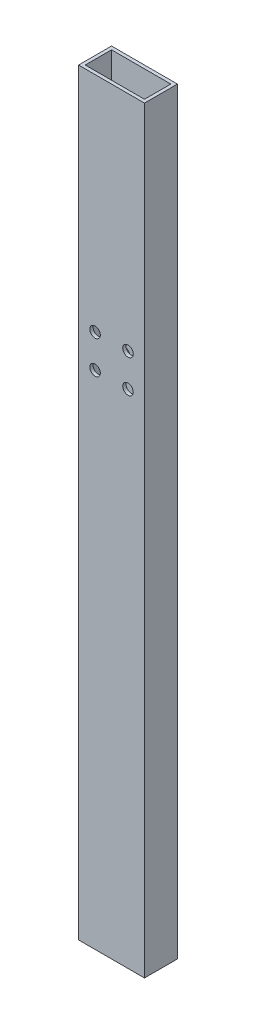
ISO-10303-21;
HEADER;
FILE_DESCRIPTION(('STEP AP214'),'2;1');
FILE_NAME('part.step','',(''),(''),'','','');
FILE_SCHEMA(('AUTOMOTIVE_DESIGN { 1 0 10303 214 1 1 1 1 }'));
ENDSEC;
DATA;
#1=APPLICATION_CONTEXT('core data for automotive mechanical design processes');
#2=APPLICATION_PROTOCOL_DEFINITION('international standard','automotive_design',2000,#1);
#3=PRODUCT_CONTEXT('',#1,'mechanical');
#4=PRODUCT('Part','Part','',(#3));
#5=PRODUCT_RELATED_PRODUCT_CATEGORY('part','',(#4));
#6=PRODUCT_DEFINITION_FORMATION('','',#4);
#7=PRODUCT_DEFINITION_CONTEXT('part definition',#1,'design');
#8=PRODUCT_DEFINITION('design','',#6,#7);
#9=PRODUCT_DEFINITION_SHAPE('','',#8);
#10=(LENGTH_UNIT() NAMED_UNIT(*) SI_UNIT(.MILLI.,.METRE.));
#11=(NAMED_UNIT(*) PLANE_ANGLE_UNIT() SI_UNIT($,.RADIAN.));
#12=(NAMED_UNIT(*) SI_UNIT($,.STERADIAN.) SOLID_ANGLE_UNIT());
#13=UNCERTAINTY_MEASURE_WITH_UNIT(LENGTH_MEASURE(1.E-05),#10,'distance_accuracy_value','');
#14=(GEOMETRIC_REPRESENTATION_CONTEXT(3) GLOBAL_UNCERTAINTY_ASSIGNED_CONTEXT((#13)) GLOBAL_UNIT_ASSIGNED_CONTEXT((#10,
#11,#12)) REPRESENTATION_CONTEXT('',''));
#15=CARTESIAN_POINT('',(0.,0.,0.));
#16=DIRECTION('',(0.,0.,1.));
#17=DIRECTION('',(1.,0.,0.));
#18=AXIS2_PLACEMENT_3D('',#15,#16,#17);
#19=CARTESIAN_POINT('',(0.,230.,0.));
#20=DIRECTION('',(0.,1.,0.));
#21=DIRECTION('',(0.,0.,1.));
#22=AXIS2_PLACEMENT_3D('',#19,#20,#21);
#23=PLANE('',#22);
#24=DIRECTION('',(0.,0.,-1.));
#25=VECTOR('',#24,1.);
#26=CARTESIAN_POINT('',(10.,230.,5.));
#27=LINE('',#26,#25);
#28=CARTESIAN_POINT('',(10.,230.,5.));
#29=VERTEX_POINT('',#28);
#30=CARTESIAN_POINT('',(10.,230.,-5.));
#31=VERTEX_POINT('',#30);
#32=EDGE_CURVE('E185',#29,#31,#27,.T.);
#33=ORIENTED_EDGE('',*,*,#32,.T.);
#34=DIRECTION('',(-1.,0.,0.));
#35=VECTOR('',#34,1.);
#36=CARTESIAN_POINT('',(-10.,230.,-5.));
#37=LINE('',#36,#35);
#38=CARTESIAN_POINT('',(-10.,230.,-5.));
#39=VERTEX_POINT('',#38);
#40=EDGE_CURVE('E189',#31,#39,#37,.T.);
#41=ORIENTED_EDGE('',*,*,#40,.T.);
#42=DIRECTION('',(0.,0.,1.));
#43=VECTOR('',#42,1.);
#44=CARTESIAN_POINT('',(-10.,230.,5.));
#45=LINE('',#44,#43);
#46=CARTESIAN_POINT('',(-10.,230.,5.));
#47=VERTEX_POINT('',#46);
#48=EDGE_CURVE('E193',#39,#47,#45,.T.);
#49=ORIENTED_EDGE('',*,*,#48,.T.);
#50=DIRECTION('',(1.,0.,0.));
#51=VECTOR('',#50,1.);
#52=CARTESIAN_POINT('',(-10.,230.,5.));
#53=LINE('',#52,#51);
#54=EDGE_CURVE('E196',#47,#29,#53,.T.);
#55=ORIENTED_EDGE('',*,*,#54,.T.);
#56=EDGE_LOOP('',(#33,#41,#49,#55));
#57=FACE_BOUND('',#56,.T.);
#58=DIRECTION('',(-1.,0.,0.));
#59=VECTOR('',#58,1.);
#60=CARTESIAN_POINT('',(0.,230.,-4.));
#61=LINE('',#60,#59);
#62=CARTESIAN_POINT('',(9.,230.,-4.));
#63=VERTEX_POINT('',#62);
#64=CARTESIAN_POINT('',(-9.,230.,-4.));
#65=VERTEX_POINT('',#64);
#66=EDGE_CURVE('E144',#63,#65,#61,.T.);
#67=ORIENTED_EDGE('',*,*,#66,.F.);
#68=DIRECTION('',(0.,0.,-1.));
#69=VECTOR('',#68,1.);
#70=CARTESIAN_POINT('',(9.,230.,0.));
#71=LINE('',#70,#69);
#72=CARTESIAN_POINT('',(9.,230.,4.));
#73=VERTEX_POINT('',#72);
#74=EDGE_CURVE('E135',#73,#63,#71,.T.);
#75=ORIENTED_EDGE('',*,*,#74,.F.);
#76=DIRECTION('',(1.,0.,0.));
#77=VECTOR('',#76,1.);
#78=CARTESIAN_POINT('',(0.,230.,4.));
#79=LINE('',#78,#77);
#80=CARTESIAN_POINT('',(-9.,230.,4.));
#81=VERTEX_POINT('',#80);
#82=EDGE_CURVE('E161',#81,#73,#79,.T.);
#83=ORIENTED_EDGE('',*,*,#82,.F.);
#84=DIRECTION('',(0.,0.,1.));
#85=VECTOR('',#84,1.);
#86=CARTESIAN_POINT('',(-9.,230.,0.));
#87=LINE('',#86,#85);
#88=EDGE_CURVE('E157',#65,#81,#87,.T.);
#89=ORIENTED_EDGE('',*,*,#88,.F.);
#90=EDGE_LOOP('',(#67,#75,#83,#89));
#91=FACE_BOUND('',#90,.T.);
#92=ADVANCED_FACE('F67',(#57,#91),#23,.T.);
#93=CARTESIAN_POINT('',(0.,0.,0.));
#94=DIRECTION('',(0.,1.,0.));
#95=DIRECTION('',(0.,0.,1.));
#96=AXIS2_PLACEMENT_3D('',#93,#94,#95);
#97=PLANE('',#96);
#98=DIRECTION('',(0.,0.,-1.));
#99=VECTOR('',#98,1.);
#100=CARTESIAN_POINT('',(10.,0.,5.));
#101=LINE('',#100,#99);
#102=CARTESIAN_POINT('',(10.,0.,5.));
#103=VERTEX_POINT('',#102);
#104=CARTESIAN_POINT('',(10.,0.,-5.));
#105=VERTEX_POINT('',#104);
#106=EDGE_CURVE('E153',#103,#105,#101,.T.);
#107=ORIENTED_EDGE('',*,*,#106,.F.);
#108=DIRECTION('',(1.,0.,0.));
#109=VECTOR('',#108,1.);
#110=CARTESIAN_POINT('',(-10.,0.,5.));
#111=LINE('',#110,#109);
#112=CARTESIAN_POINT('',(-10.,0.,5.));
#113=VERTEX_POINT('',#112);
#114=EDGE_CURVE('E190',#113,#103,#111,.T.);
#115=ORIENTED_EDGE('',*,*,#114,.F.);
#116=DIRECTION('',(0.,0.,1.));
#117=VECTOR('',#116,1.);
#118=CARTESIAN_POINT('',(-10.,0.,5.));
#119=LINE('',#118,#117);
#120=CARTESIAN_POINT('',(-10.,0.,-5.));
#121=VERTEX_POINT('',#120);
#122=EDGE_CURVE('E206',#121,#113,#119,.T.);
#123=ORIENTED_EDGE('',*,*,#122,.F.);
#124=DIRECTION('',(-1.,0.,0.));
#125=VECTOR('',#124,1.);
#126=CARTESIAN_POINT('',(-10.,0.,-5.));
#127=LINE('',#126,#125);
#128=EDGE_CURVE('E203',#105,#121,#127,.T.);
#129=ORIENTED_EDGE('',*,*,#128,.F.);
#130=EDGE_LOOP('',(#107,#115,#123,#129));
#131=FACE_BOUND('',#130,.T.);
#132=DIRECTION('',(0.,0.,-1.));
#133=VECTOR('',#132,1.);
#134=CARTESIAN_POINT('',(9.,0.,0.));
#135=LINE('',#134,#133);
#136=CARTESIAN_POINT('',(9.,0.,4.));
#137=VERTEX_POINT('',#136);
#138=CARTESIAN_POINT('',(9.,0.,-4.));
#139=VERTEX_POINT('',#138);
#140=EDGE_CURVE('E93',#137,#139,#135,.T.);
#141=ORIENTED_EDGE('',*,*,#140,.T.);
#142=DIRECTION('',(-1.,0.,0.));
#143=VECTOR('',#142,1.);
#144=CARTESIAN_POINT('',(0.,0.,-4.));
#145=LINE('',#144,#143);
#146=CARTESIAN_POINT('',(-9.,0.,-4.));
#147=VERTEX_POINT('',#146);
#148=EDGE_CURVE('E151',#139,#147,#145,.T.);
#149=ORIENTED_EDGE('',*,*,#148,.T.);
#150=DIRECTION('',(0.,0.,1.));
#151=VECTOR('',#150,1.);
#152=CARTESIAN_POINT('',(-9.,0.,0.));
#153=LINE('',#152,#151);
#154=CARTESIAN_POINT('',(-9.,0.,4.));
#155=VERTEX_POINT('',#154);
#156=EDGE_CURVE('E172',#147,#155,#153,.T.);
#157=ORIENTED_EDGE('',*,*,#156,.T.);
#158=DIRECTION('',(1.,0.,0.));
#159=VECTOR('',#158,1.);
#160=CARTESIAN_POINT('',(0.,0.,4.));
#161=LINE('',#160,#159);
#162=EDGE_CURVE('E145',#155,#137,#161,.T.);
#163=ORIENTED_EDGE('',*,*,#162,.T.);
#164=EDGE_LOOP('',(#141,#149,#157,#163));
#165=FACE_BOUND('',#164,.T.);
#166=ADVANCED_FACE('F270',(#131,#165),#97,.F.);
#167=CARTESIAN_POINT('',(10.,230.,5.));
#168=DIRECTION('',(-1.,0.,0.));
#169=DIRECTION('',(0.,0.,1.));
#170=AXIS2_PLACEMENT_3D('',#167,#168,#169);
#171=PLANE('',#170);
#172=ORIENTED_EDGE('',*,*,#106,.T.);
#173=DIRECTION('',(0.,-1.,0.));
#174=VECTOR('',#173,1.);
#175=CARTESIAN_POINT('',(10.,230.,-5.));
#176=LINE('',#175,#174);
#177=EDGE_CURVE('E12',#31,#105,#176,.T.);
#178=ORIENTED_EDGE('',*,*,#177,.F.);
#179=ORIENTED_EDGE('',*,*,#32,.F.);
#180=DIRECTION('',(0.,-1.,0.));
#181=VECTOR('',#180,1.);
#182=CARTESIAN_POINT('',(10.,230.,5.));
#183=LINE('',#182,#181);
#184=EDGE_CURVE('E199',#29,#103,#183,.T.);
#185=ORIENTED_EDGE('',*,*,#184,.T.);
#186=EDGE_LOOP('',(#172,#178,#179,#185));
#187=FACE_BOUND('',#186,.T.);
#188=ADVANCED_FACE('F69',(#187),#171,.F.);
#189=CARTESIAN_POINT('',(-10.,230.,-5.));
#190=DIRECTION('',(0.,0.,1.));
#191=DIRECTION('',(1.,0.,0.));
#192=AXIS2_PLACEMENT_3D('',#189,#190,#191);
#193=PLANE('',#192);
#194=CARTESIAN_POINT('',(5.,162.3,-5.));
#195=DIRECTION('',(0.,0.,1.));
#196=DIRECTION('',(-1.,0.,0.));
#197=AXIS2_PLACEMENT_3D('',#194,#195,#196);
#198=CIRCLE('',#197,1.59999999999998);
#199=CARTESIAN_POINT('',(3.40000000000002,162.3,-5.));
#200=VERTEX_POINT('',#199);
#201=EDGE_CURVE('E306',#200,#200,#198,.T.);
#202=ORIENTED_EDGE('',*,*,#201,.T.);
#203=EDGE_LOOP('',(#202));
#204=FACE_BOUND('',#203,.T.);
#205=CARTESIAN_POINT('',(5.,152.3,-5.));
#206=DIRECTION('',(0.,0.,1.));
#207=DIRECTION('',(1.,0.,0.));
#208=AXIS2_PLACEMENT_3D('',#205,#206,#207);
#209=CIRCLE('',#208,1.59999999999998);
#210=CARTESIAN_POINT('',(6.59999999999998,152.3,-5.));
#211=VERTEX_POINT('',#210);
#212=EDGE_CURVE('E310',#211,#211,#209,.T.);
#213=ORIENTED_EDGE('',*,*,#212,.T.);
#214=EDGE_LOOP('',(#213));
#215=FACE_BOUND('',#214,.T.);
#216=CARTESIAN_POINT('',(-5.,152.3,-5.));
#217=DIRECTION('',(0.,0.,1.));
#218=DIRECTION('',(-1.,0.,0.));
#219=AXIS2_PLACEMENT_3D('',#216,#217,#218);
#220=CIRCLE('',#219,1.59999999999998);
#221=CARTESIAN_POINT('',(-6.59999999999998,152.3,-5.));
#222=VERTEX_POINT('',#221);
#223=EDGE_CURVE('E314',#222,#222,#220,.T.);
#224=ORIENTED_EDGE('',*,*,#223,.T.);
#225=EDGE_LOOP('',(#224));
#226=FACE_BOUND('',#225,.T.);
#227=CARTESIAN_POINT('',(-5.,162.3,-5.));
#228=DIRECTION('',(0.,0.,1.));
#229=DIRECTION('',(1.,0.,0.));
#230=AXIS2_PLACEMENT_3D('',#227,#228,#229);
#231=CIRCLE('',#230,1.59999999999998);
#232=CARTESIAN_POINT('',(-3.40000000000002,162.3,-5.));
#233=VERTEX_POINT('',#232);
#234=EDGE_CURVE('E226',#233,#233,#231,.T.);
#235=ORIENTED_EDGE('',*,*,#234,.T.);
#236=EDGE_LOOP('',(#235));
#237=FACE_BOUND('',#236,.T.);
#238=ORIENTED_EDGE('',*,*,#128,.T.);
#239=DIRECTION('',(0.,-1.,0.));
#240=VECTOR('',#239,1.);
#241=CARTESIAN_POINT('',(-10.,230.,-5.));
#242=LINE('',#241,#240);
#243=EDGE_CURVE('E77',#39,#121,#242,.T.);
#244=ORIENTED_EDGE('',*,*,#243,.F.);
#245=ORIENTED_EDGE('',*,*,#40,.F.);
#246=ORIENTED_EDGE('',*,*,#177,.T.);
#247=EDGE_LOOP('',(#238,#244,#245,#246));
#248=FACE_BOUND('',#247,.T.);
#249=ADVANCED_FACE('F295',(#204,#215,#226,#237,#248),#193,.F.);
#250=CARTESIAN_POINT('',(-10.,230.,5.));
#251=DIRECTION('',(1.,0.,0.));
#252=DIRECTION('',(0.,0.,-1.));
#253=AXIS2_PLACEMENT_3D('',#250,#251,#252);
#254=PLANE('',#253);
#255=ORIENTED_EDGE('',*,*,#122,.T.);
#256=DIRECTION('',(0.,-1.,0.));
#257=VECTOR('',#256,1.);
#258=CARTESIAN_POINT('',(-10.,230.,5.));
#259=LINE('',#258,#257);
#260=EDGE_CURVE('E214',#47,#113,#259,.T.);
#261=ORIENTED_EDGE('',*,*,#260,.F.);
#262=ORIENTED_EDGE('',*,*,#48,.F.);
#263=ORIENTED_EDGE('',*,*,#243,.T.);
#264=EDGE_LOOP('',(#255,#261,#262,#263));
#265=FACE_BOUND('',#264,.T.);
#266=ADVANCED_FACE('F292',(#265),#254,.F.);
#267=CARTESIAN_POINT('',(-10.,230.,5.));
#268=DIRECTION('',(0.,0.,-1.));
#269=DIRECTION('',(-1.,0.,0.));
#270=AXIS2_PLACEMENT_3D('',#267,#268,#269);
#271=PLANE('',#270);
#272=CARTESIAN_POINT('',(5.,162.3,5.));
#273=DIRECTION('',(0.,0.,1.));
#274=DIRECTION('',(-1.,0.,0.));
#275=AXIS2_PLACEMENT_3D('',#272,#273,#274);
#276=CIRCLE('',#275,1.59999999999998);
#277=CARTESIAN_POINT('',(3.40000000000002,162.3,5.));
#278=VERTEX_POINT('',#277);
#279=EDGE_CURVE('E339',#278,#278,#276,.T.);
#280=ORIENTED_EDGE('',*,*,#279,.F.);
#281=EDGE_LOOP('',(#280));
#282=FACE_BOUND('',#281,.T.);
#283=CARTESIAN_POINT('',(5.,152.3,5.));
#284=DIRECTION('',(0.,0.,1.));
#285=DIRECTION('',(1.,0.,0.));
#286=AXIS2_PLACEMENT_3D('',#283,#284,#285);
#287=CIRCLE('',#286,1.59999999999998);
#288=CARTESIAN_POINT('',(6.59999999999998,152.3,5.));
#289=VERTEX_POINT('',#288);
#290=EDGE_CURVE('E345',#289,#289,#287,.T.);
#291=ORIENTED_EDGE('',*,*,#290,.F.);
#292=EDGE_LOOP('',(#291));
#293=FACE_BOUND('',#292,.T.);
#294=CARTESIAN_POINT('',(-5.,152.3,5.));
#295=DIRECTION('',(0.,0.,1.));
#296=DIRECTION('',(-1.,0.,0.));
#297=AXIS2_PLACEMENT_3D('',#294,#295,#296);
#298=CIRCLE('',#297,1.59999999999998);
#299=CARTESIAN_POINT('',(-6.59999999999998,152.3,5.));
#300=VERTEX_POINT('',#299);
#301=EDGE_CURVE('E335',#300,#300,#298,.T.);
#302=ORIENTED_EDGE('',*,*,#301,.F.);
#303=EDGE_LOOP('',(#302));
#304=FACE_BOUND('',#303,.T.);
#305=CARTESIAN_POINT('',(-5.,162.3,5.));
#306=DIRECTION('',(0.,0.,1.));
#307=DIRECTION('',(1.,0.,0.));
#308=AXIS2_PLACEMENT_3D('',#305,#306,#307);
#309=CIRCLE('',#308,1.59999999999998);
#310=CARTESIAN_POINT('',(-3.40000000000002,162.3,5.));
#311=VERTEX_POINT('',#310);
#312=EDGE_CURVE('E331',#311,#311,#309,.T.);
#313=ORIENTED_EDGE('',*,*,#312,.F.);
#314=EDGE_LOOP('',(#313));
#315=FACE_BOUND('',#314,.T.);
#316=ORIENTED_EDGE('',*,*,#114,.T.);
#317=ORIENTED_EDGE('',*,*,#184,.F.);
#318=ORIENTED_EDGE('',*,*,#54,.F.);
#319=ORIENTED_EDGE('',*,*,#260,.T.);
#320=EDGE_LOOP('',(#316,#317,#318,#319));
#321=FACE_BOUND('',#320,.T.);
#322=ADVANCED_FACE('F289',(#282,#293,#304,#315,#321),#271,.F.);
#323=CARTESIAN_POINT('',(9.,230.,0.));
#324=DIRECTION('',(-1.,0.,0.));
#325=DIRECTION('',(0.,0.,1.));
#326=AXIS2_PLACEMENT_3D('',#323,#324,#325);
#327=PLANE('',#326);
#328=ORIENTED_EDGE('',*,*,#140,.F.);
#329=DIRECTION('',(0.,-1.,0.));
#330=VECTOR('',#329,1.);
#331=CARTESIAN_POINT('',(9.,230.,4.));
#332=LINE('',#331,#330);
#333=EDGE_CURVE('E139',#73,#137,#332,.T.);
#334=ORIENTED_EDGE('',*,*,#333,.F.);
#335=ORIENTED_EDGE('',*,*,#74,.T.);
#336=DIRECTION('',(0.,-1.,0.));
#337=VECTOR('',#336,1.);
#338=CARTESIAN_POINT('',(9.,230.,-4.));
#339=LINE('',#338,#337);
#340=EDGE_CURVE('E138',#63,#139,#339,.T.);
#341=ORIENTED_EDGE('',*,*,#340,.T.);
#342=EDGE_LOOP('',(#328,#334,#335,#341));
#343=FACE_BOUND('',#342,.T.);
#344=ADVANCED_FACE('F137',(#343),#327,.T.);
#345=CARTESIAN_POINT('',(0.,230.,-4.));
#346=DIRECTION('',(0.,0.,1.));
#347=DIRECTION('',(1.,0.,0.));
#348=AXIS2_PLACEMENT_3D('',#345,#346,#347);
#349=PLANE('',#348);
#350=CARTESIAN_POINT('',(5.,162.3,-4.));
#351=DIRECTION('',(0.,0.,1.));
#352=DIRECTION('',(1.,0.,0.));
#353=AXIS2_PLACEMENT_3D('',#350,#351,#352);
#354=CIRCLE('',#353,1.59999999999998);
#355=CARTESIAN_POINT('',(6.59999999999998,162.3,-4.));
#356=VERTEX_POINT('',#355);
#357=EDGE_CURVE('E169',#356,#356,#354,.T.);
#358=ORIENTED_EDGE('',*,*,#357,.F.);
#359=EDGE_LOOP('',(#358));
#360=FACE_BOUND('',#359,.T.);
#361=CARTESIAN_POINT('',(5.,152.3,-4.));
#362=DIRECTION('',(0.,0.,1.));
#363=DIRECTION('',(1.,0.,0.));
#364=AXIS2_PLACEMENT_3D('',#361,#362,#363);
#365=CIRCLE('',#364,1.59999999999998);
#366=CARTESIAN_POINT('',(6.59999999999998,152.3,-4.));
#367=VERTEX_POINT('',#366);
#368=EDGE_CURVE('E234',#367,#367,#365,.T.);
#369=ORIENTED_EDGE('',*,*,#368,.F.);
#370=EDGE_LOOP('',(#369));
#371=FACE_BOUND('',#370,.T.);
#372=CARTESIAN_POINT('',(-5.,152.3,-4.));
#373=DIRECTION('',(0.,0.,1.));
#374=DIRECTION('',(1.,0.,0.));
#375=AXIS2_PLACEMENT_3D('',#372,#373,#374);
#376=CIRCLE('',#375,1.59999999999998);
#377=CARTESIAN_POINT('',(-3.40000000000002,152.3,-4.));
#378=VERTEX_POINT('',#377);
#379=EDGE_CURVE('E230',#378,#378,#376,.T.);
#380=ORIENTED_EDGE('',*,*,#379,.F.);
#381=EDGE_LOOP('',(#380));
#382=FACE_BOUND('',#381,.T.);
#383=CARTESIAN_POINT('',(-5.,162.3,-4.));
#384=DIRECTION('',(0.,0.,1.));
#385=DIRECTION('',(1.,0.,0.));
#386=AXIS2_PLACEMENT_3D('',#383,#384,#385);
#387=CIRCLE('',#386,1.59999999999998);
#388=CARTESIAN_POINT('',(-3.40000000000002,162.3,-4.));
#389=VERTEX_POINT('',#388);
#390=EDGE_CURVE('E225',#389,#389,#387,.T.);
#391=ORIENTED_EDGE('',*,*,#390,.F.);
#392=EDGE_LOOP('',(#391));
#393=FACE_BOUND('',#392,.T.);
#394=ORIENTED_EDGE('',*,*,#148,.F.);
#395=ORIENTED_EDGE('',*,*,#340,.F.);
#396=ORIENTED_EDGE('',*,*,#66,.T.);
#397=DIRECTION('',(0.,-1.,0.));
#398=VECTOR('',#397,1.);
#399=CARTESIAN_POINT('',(-9.,230.,-4.));
#400=LINE('',#399,#398);
#401=EDGE_CURVE('E154',#65,#147,#400,.T.);
#402=ORIENTED_EDGE('',*,*,#401,.T.);
#403=EDGE_LOOP('',(#394,#395,#396,#402));
#404=FACE_BOUND('',#403,.T.);
#405=ADVANCED_FACE('F148',(#360,#371,#382,#393,#404),#349,.T.);
#406=CARTESIAN_POINT('',(-9.,230.,0.));
#407=DIRECTION('',(1.,0.,0.));
#408=DIRECTION('',(0.,0.,-1.));
#409=AXIS2_PLACEMENT_3D('',#406,#407,#408);
#410=PLANE('',#409);
#411=ORIENTED_EDGE('',*,*,#156,.F.);
#412=ORIENTED_EDGE('',*,*,#401,.F.);
#413=ORIENTED_EDGE('',*,*,#88,.T.);
#414=DIRECTION('',(0.,-1.,0.));
#415=VECTOR('',#414,1.);
#416=CARTESIAN_POINT('',(-9.,230.,4.));
#417=LINE('',#416,#415);
#418=EDGE_CURVE('E85',#81,#155,#417,.T.);
#419=ORIENTED_EDGE('',*,*,#418,.T.);
#420=EDGE_LOOP('',(#411,#412,#413,#419));
#421=FACE_BOUND('',#420,.T.);
#422=ADVANCED_FACE('F262',(#421),#410,.T.);
#423=CARTESIAN_POINT('',(0.,230.,4.));
#424=DIRECTION('',(0.,0.,-1.));
#425=DIRECTION('',(-1.,0.,0.));
#426=AXIS2_PLACEMENT_3D('',#423,#424,#425);
#427=PLANE('',#426);
#428=CARTESIAN_POINT('',(5.,162.3,4.));
#429=DIRECTION('',(0.,0.,-1.));
#430=DIRECTION('',(-1.,0.,0.));
#431=AXIS2_PLACEMENT_3D('',#428,#429,#430);
#432=CIRCLE('',#431,1.59999999999998);
#433=CARTESIAN_POINT('',(3.40000000000002,162.3,4.));
#434=VERTEX_POINT('',#433);
#435=EDGE_CURVE('E71',#434,#434,#432,.T.);
#436=ORIENTED_EDGE('',*,*,#435,.F.);
#437=EDGE_LOOP('',(#436));
#438=FACE_BOUND('',#437,.T.);
#439=CARTESIAN_POINT('',(5.,152.3,4.));
#440=DIRECTION('',(0.,0.,-1.));
#441=DIRECTION('',(-1.,0.,0.));
#442=AXIS2_PLACEMENT_3D('',#439,#440,#441);
#443=CIRCLE('',#442,1.59999999999998);
#444=CARTESIAN_POINT('',(3.40000000000002,152.3,4.));
#445=VERTEX_POINT('',#444);
#446=EDGE_CURVE('E231',#445,#445,#443,.T.);
#447=ORIENTED_EDGE('',*,*,#446,.F.);
#448=EDGE_LOOP('',(#447));
#449=FACE_BOUND('',#448,.T.);
#450=CARTESIAN_POINT('',(-5.,152.3,4.));
#451=DIRECTION('',(0.,0.,-1.));
#452=DIRECTION('',(-1.,0.,0.));
#453=AXIS2_PLACEMENT_3D('',#450,#451,#452);
#454=CIRCLE('',#453,1.59999999999998);
#455=CARTESIAN_POINT('',(-6.59999999999998,152.3,4.));
#456=VERTEX_POINT('',#455);
#457=EDGE_CURVE('E227',#456,#456,#454,.T.);
#458=ORIENTED_EDGE('',*,*,#457,.F.);
#459=EDGE_LOOP('',(#458));
#460=FACE_BOUND('',#459,.T.);
#461=CARTESIAN_POINT('',(-5.,162.3,4.));
#462=DIRECTION('',(0.,0.,-1.));
#463=DIRECTION('',(-1.,0.,0.));
#464=AXIS2_PLACEMENT_3D('',#461,#462,#463);
#465=CIRCLE('',#464,1.59999999999998);
#466=CARTESIAN_POINT('',(-6.59999999999998,162.3,4.));
#467=VERTEX_POINT('',#466);
#468=EDGE_CURVE('E221',#467,#467,#465,.T.);
#469=ORIENTED_EDGE('',*,*,#468,.F.);
#470=EDGE_LOOP('',(#469));
#471=FACE_BOUND('',#470,.T.);
#472=ORIENTED_EDGE('',*,*,#162,.F.);
#473=ORIENTED_EDGE('',*,*,#418,.F.);
#474=ORIENTED_EDGE('',*,*,#82,.T.);
#475=ORIENTED_EDGE('',*,*,#333,.T.);
#476=EDGE_LOOP('',(#472,#473,#474,#475));
#477=FACE_BOUND('',#476,.T.);
#478=ADVANCED_FACE('F258',(#438,#449,#460,#471,#477),#427,.T.);
#479=CARTESIAN_POINT('',(-5.,162.3,-5.));
#480=DIRECTION('',(0.,0.,1.));
#481=DIRECTION('',(1.,0.,0.));
#482=AXIS2_PLACEMENT_3D('',#479,#480,#481);
#483=CYLINDRICAL_SURFACE('',#482,1.59999999999998);
#484=ORIENTED_EDGE('',*,*,#468,.T.);
#485=EDGE_LOOP('',(#484));
#486=FACE_BOUND('',#485,.T.);
#487=ORIENTED_EDGE('',*,*,#312,.T.);
#488=EDGE_LOOP('',(#487));
#489=FACE_BOUND('',#488,.T.);
#490=ADVANCED_FACE('F261',(#486,#489),#483,.F.);
#491=CARTESIAN_POINT('',(-5.,152.3,-5.));
#492=DIRECTION('',(0.,0.,1.));
#493=DIRECTION('',(1.,0.,0.));
#494=AXIS2_PLACEMENT_3D('',#491,#492,#493);
#495=CYLINDRICAL_SURFACE('',#494,1.59999999999998);
#496=ORIENTED_EDGE('',*,*,#457,.T.);
#497=EDGE_LOOP('',(#496));
#498=FACE_BOUND('',#497,.T.);
#499=ORIENTED_EDGE('',*,*,#301,.T.);
#500=EDGE_LOOP('',(#499));
#501=FACE_BOUND('',#500,.T.);
#502=ADVANCED_FACE('F355',(#498,#501),#495,.F.);
#503=CARTESIAN_POINT('',(5.,152.3,-5.));
#504=DIRECTION('',(0.,0.,1.));
#505=DIRECTION('',(1.,0.,0.));
#506=AXIS2_PLACEMENT_3D('',#503,#504,#505);
#507=CYLINDRICAL_SURFACE('',#506,1.59999999999998);
#508=ORIENTED_EDGE('',*,*,#446,.T.);
#509=EDGE_LOOP('',(#508));
#510=FACE_BOUND('',#509,.T.);
#511=ORIENTED_EDGE('',*,*,#290,.T.);
#512=EDGE_LOOP('',(#511));
#513=FACE_BOUND('',#512,.T.);
#514=ADVANCED_FACE('F367',(#510,#513),#507,.F.);
#515=CARTESIAN_POINT('',(5.,162.3,-5.));
#516=DIRECTION('',(0.,0.,1.));
#517=DIRECTION('',(1.,0.,0.));
#518=AXIS2_PLACEMENT_3D('',#515,#516,#517);
#519=CYLINDRICAL_SURFACE('',#518,1.59999999999998);
#520=ORIENTED_EDGE('',*,*,#435,.T.);
#521=EDGE_LOOP('',(#520));
#522=FACE_BOUND('',#521,.T.);
#523=ORIENTED_EDGE('',*,*,#279,.T.);
#524=EDGE_LOOP('',(#523));
#525=FACE_BOUND('',#524,.T.);
#526=ADVANCED_FACE('F255',(#522,#525),#519,.F.);
#527=ORIENTED_EDGE('',*,*,#390,.T.);
#528=EDGE_LOOP('',(#527));
#529=FACE_BOUND('',#528,.T.);
#530=ORIENTED_EDGE('',*,*,#234,.F.);
#531=EDGE_LOOP('',(#530));
#532=FACE_BOUND('',#531,.T.);
#533=ADVANCED_FACE('F363',(#529,#532),#483,.F.);
#534=ORIENTED_EDGE('',*,*,#379,.T.);
#535=EDGE_LOOP('',(#534));
#536=FACE_BOUND('',#535,.T.);
#537=ORIENTED_EDGE('',*,*,#223,.F.);
#538=EDGE_LOOP('',(#537));
#539=FACE_BOUND('',#538,.T.);
#540=ADVANCED_FACE('F370',(#536,#539),#495,.F.);
#541=ORIENTED_EDGE('',*,*,#368,.T.);
#542=EDGE_LOOP('',(#541));
#543=FACE_BOUND('',#542,.T.);
#544=ORIENTED_EDGE('',*,*,#212,.F.);
#545=EDGE_LOOP('',(#544));
#546=FACE_BOUND('',#545,.T.);
#547=ADVANCED_FACE('F378',(#543,#546),#507,.F.);
#548=ORIENTED_EDGE('',*,*,#357,.T.);
#549=EDGE_LOOP('',(#548));
#550=FACE_BOUND('',#549,.T.);
#551=ORIENTED_EDGE('',*,*,#201,.F.);
#552=EDGE_LOOP('',(#551));
#553=FACE_BOUND('',#552,.T.);
#554=ADVANCED_FACE('F379',(#550,#553),#519,.F.);
#555=CLOSED_SHELL('',(#92,#166,#188,#249,#266,#322,#344,#405,#422,#478,#490,#502,#514,#526,#533,
#540,#547,#554));
#556=MANIFOLD_SOLID_BREP('B2',#555);
#557=ADVANCED_BREP_SHAPE_REPRESENTATION('',(#18,#556),#14);
#558=SHAPE_DEFINITION_REPRESENTATION(#9,#557);
ENDSEC;
END-ISO-10303-21;
